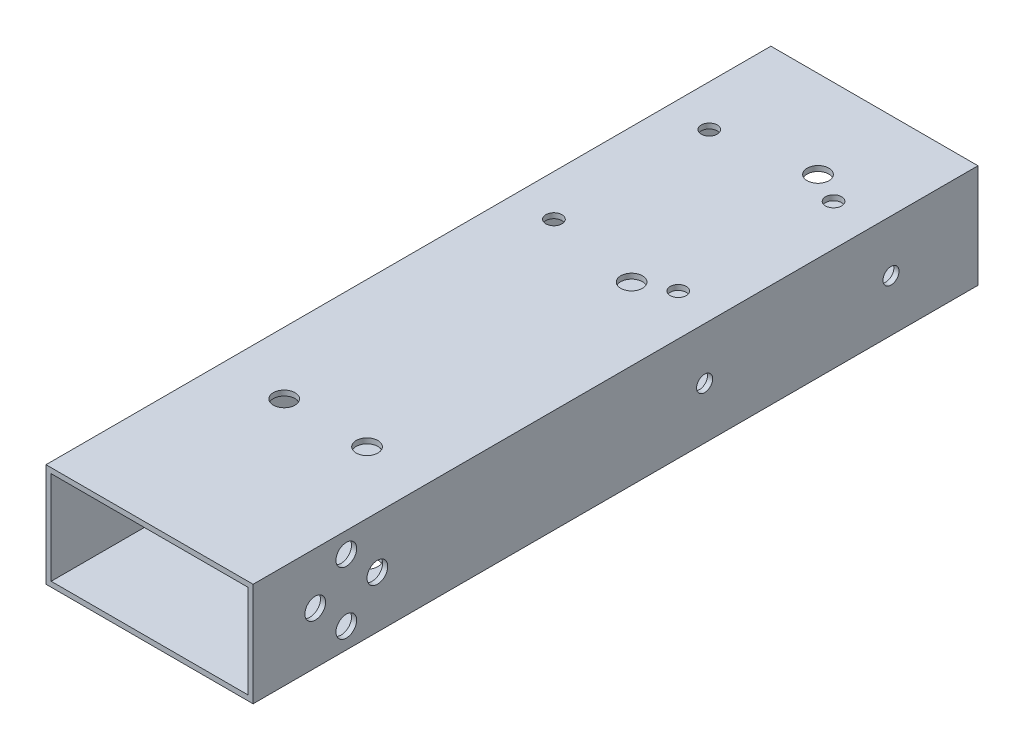
ISO-10303-21;
HEADER;
FILE_DESCRIPTION(('STEP AP214'),'2;1');
FILE_NAME('part.step','',(''),(''),'','','');
FILE_SCHEMA(('AUTOMOTIVE_DESIGN { 1 0 10303 214 1 1 1 1 }'));
ENDSEC;
DATA;
#1=APPLICATION_CONTEXT('core data for automotive mechanical design processes');
#2=APPLICATION_PROTOCOL_DEFINITION('international standard','automotive_design',2000,#1);
#3=PRODUCT_CONTEXT('',#1,'mechanical');
#4=PRODUCT('Part','Part','',(#3));
#5=PRODUCT_RELATED_PRODUCT_CATEGORY('part','',(#4));
#6=PRODUCT_DEFINITION_FORMATION('','',#4);
#7=PRODUCT_DEFINITION_CONTEXT('part definition',#1,'design');
#8=PRODUCT_DEFINITION('design','',#6,#7);
#9=PRODUCT_DEFINITION_SHAPE('','',#8);
#10=(LENGTH_UNIT() NAMED_UNIT(*) SI_UNIT(.MILLI.,.METRE.));
#11=(NAMED_UNIT(*) PLANE_ANGLE_UNIT() SI_UNIT($,.RADIAN.));
#12=(NAMED_UNIT(*) SI_UNIT($,.STERADIAN.) SOLID_ANGLE_UNIT());
#13=UNCERTAINTY_MEASURE_WITH_UNIT(LENGTH_MEASURE(1.E-05),#10,'distance_accuracy_value','');
#14=(GEOMETRIC_REPRESENTATION_CONTEXT(3) GLOBAL_UNCERTAINTY_ASSIGNED_CONTEXT((#13)) GLOBAL_UNIT_ASSIGNED_CONTEXT((#10,
#11,#12)) REPRESENTATION_CONTEXT('',''));
#15=CARTESIAN_POINT('',(0.,0.,0.));
#16=DIRECTION('',(0.,0.,1.));
#17=DIRECTION('',(1.,0.,0.));
#18=AXIS2_PLACEMENT_3D('',#15,#16,#17);
#19=CARTESIAN_POINT('',(0.,0.,140.));
#20=DIRECTION('',(0.,0.,-1.));
#21=DIRECTION('',(-1.,0.,0.));
#22=AXIS2_PLACEMENT_3D('',#19,#20,#21);
#23=PLANE('',#22);
#24=DIRECTION('',(0.,-1.,0.));
#25=VECTOR('',#24,1.);
#26=CARTESIAN_POINT('',(0.,0.,140.));
#27=LINE('',#26,#25);
#28=CARTESIAN_POINT('',(0.,20.,140.));
#29=VERTEX_POINT('',#28);
#30=CARTESIAN_POINT('',(0.,0.,140.));
#31=VERTEX_POINT('',#30);
#32=EDGE_CURVE('E138',#29,#31,#27,.T.);
#33=ORIENTED_EDGE('',*,*,#32,.T.);
#34=DIRECTION('',(1.,0.,0.));
#35=VECTOR('',#34,1.);
#36=CARTESIAN_POINT('',(0.,0.,140.));
#37=LINE('',#36,#35);
#38=CARTESIAN_POINT('',(40.,0.,140.));
#39=VERTEX_POINT('',#38);
#40=EDGE_CURVE('E141',#31,#39,#37,.T.);
#41=ORIENTED_EDGE('',*,*,#40,.T.);
#42=DIRECTION('',(0.,1.,0.));
#43=VECTOR('',#42,1.);
#44=CARTESIAN_POINT('',(40.,0.,140.));
#45=LINE('',#44,#43);
#46=CARTESIAN_POINT('',(40.,20.,140.));
#47=VERTEX_POINT('',#46);
#48=EDGE_CURVE('E144',#39,#47,#45,.T.);
#49=ORIENTED_EDGE('',*,*,#48,.T.);
#50=DIRECTION('',(-1.,0.,0.));
#51=VECTOR('',#50,1.);
#52=CARTESIAN_POINT('',(0.,20.,140.));
#53=LINE('',#52,#51);
#54=EDGE_CURVE('E146',#47,#29,#53,.T.);
#55=ORIENTED_EDGE('',*,*,#54,.T.);
#56=EDGE_LOOP('',(#33,#41,#49,#55));
#57=FACE_BOUND('',#56,.T.);
#58=DIRECTION('',(0.,-1.,0.));
#59=VECTOR('',#58,1.);
#60=CARTESIAN_POINT('',(1.,1.,140.));
#61=LINE('',#60,#59);
#62=CARTESIAN_POINT('',(1.,19.,140.));
#63=VERTEX_POINT('',#62);
#64=CARTESIAN_POINT('',(1.,1.,140.));
#65=VERTEX_POINT('',#64);
#66=EDGE_CURVE('E100',#63,#65,#61,.T.);
#67=ORIENTED_EDGE('',*,*,#66,.F.);
#68=DIRECTION('',(-1.,0.,0.));
#69=VECTOR('',#68,1.);
#70=CARTESIAN_POINT('',(1.,19.,140.));
#71=LINE('',#70,#69);
#72=CARTESIAN_POINT('',(39.,19.,140.));
#73=VERTEX_POINT('',#72);
#74=EDGE_CURVE('E122',#73,#63,#71,.T.);
#75=ORIENTED_EDGE('',*,*,#74,.F.);
#76=DIRECTION('',(0.,1.,0.));
#77=VECTOR('',#76,1.);
#78=CARTESIAN_POINT('',(39.,1.,140.));
#79=LINE('',#78,#77);
#80=CARTESIAN_POINT('',(39.,1.,140.));
#81=VERTEX_POINT('',#80);
#82=EDGE_CURVE('E120',#81,#73,#79,.T.);
#83=ORIENTED_EDGE('',*,*,#82,.F.);
#84=DIRECTION('',(1.,0.,0.));
#85=VECTOR('',#84,1.);
#86=CARTESIAN_POINT('',(1.,1.,140.));
#87=LINE('',#86,#85);
#88=EDGE_CURVE('E108',#65,#81,#87,.T.);
#89=ORIENTED_EDGE('',*,*,#88,.F.);
#90=EDGE_LOOP('',(#67,#75,#83,#89));
#91=FACE_BOUND('',#90,.T.);
#92=ADVANCED_FACE('F33',(#57,#91),#23,.F.);
#93=CARTESIAN_POINT('',(0.,0.,0.));
#94=DIRECTION('',(0.,0.,-1.));
#95=DIRECTION('',(-1.,0.,0.));
#96=AXIS2_PLACEMENT_3D('',#93,#94,#95);
#97=PLANE('',#96);
#98=DIRECTION('',(0.,-1.,0.));
#99=VECTOR('',#98,1.);
#100=CARTESIAN_POINT('',(0.,0.,0.));
#101=LINE('',#100,#99);
#102=CARTESIAN_POINT('',(0.,20.,0.));
#103=VERTEX_POINT('',#102);
#104=CARTESIAN_POINT('',(0.,0.,0.));
#105=VERTEX_POINT('',#104);
#106=EDGE_CURVE('E116',#103,#105,#101,.T.);
#107=ORIENTED_EDGE('',*,*,#106,.F.);
#108=DIRECTION('',(-1.,0.,0.));
#109=VECTOR('',#108,1.);
#110=CARTESIAN_POINT('',(0.,20.,0.));
#111=LINE('',#110,#109);
#112=CARTESIAN_POINT('',(40.,20.,0.));
#113=VERTEX_POINT('',#112);
#114=EDGE_CURVE('E142',#113,#103,#111,.T.);
#115=ORIENTED_EDGE('',*,*,#114,.F.);
#116=DIRECTION('',(0.,1.,0.));
#117=VECTOR('',#116,1.);
#118=CARTESIAN_POINT('',(40.,0.,0.));
#119=LINE('',#118,#117);
#120=CARTESIAN_POINT('',(40.,0.,0.));
#121=VERTEX_POINT('',#120);
#122=EDGE_CURVE('E153',#121,#113,#119,.T.);
#123=ORIENTED_EDGE('',*,*,#122,.F.);
#124=DIRECTION('',(1.,0.,0.));
#125=VECTOR('',#124,1.);
#126=CARTESIAN_POINT('',(0.,0.,0.));
#127=LINE('',#126,#125);
#128=EDGE_CURVE('E151',#105,#121,#127,.T.);
#129=ORIENTED_EDGE('',*,*,#128,.F.);
#130=EDGE_LOOP('',(#107,#115,#123,#129));
#131=FACE_BOUND('',#130,.T.);
#132=DIRECTION('',(-1.,0.,0.));
#133=VECTOR('',#132,1.);
#134=CARTESIAN_POINT('',(1.,19.,0.));
#135=LINE('',#134,#133);
#136=CARTESIAN_POINT('',(39.,19.,0.));
#137=VERTEX_POINT('',#136);
#138=CARTESIAN_POINT('',(1.,19.,0.));
#139=VERTEX_POINT('',#138);
#140=EDGE_CURVE('E109',#137,#139,#135,.T.);
#141=ORIENTED_EDGE('',*,*,#140,.T.);
#142=DIRECTION('',(0.,-1.,0.));
#143=VECTOR('',#142,1.);
#144=CARTESIAN_POINT('',(1.,1.,0.));
#145=LINE('',#144,#143);
#146=CARTESIAN_POINT('',(1.,1.,0.));
#147=VERTEX_POINT('',#146);
#148=EDGE_CURVE('E58',#139,#147,#145,.T.);
#149=ORIENTED_EDGE('',*,*,#148,.T.);
#150=DIRECTION('',(1.,0.,0.));
#151=VECTOR('',#150,1.);
#152=CARTESIAN_POINT('',(1.,1.,0.));
#153=LINE('',#152,#151);
#154=CARTESIAN_POINT('',(39.,1.,0.));
#155=VERTEX_POINT('',#154);
#156=EDGE_CURVE('E115',#147,#155,#153,.T.);
#157=ORIENTED_EDGE('',*,*,#156,.T.);
#158=DIRECTION('',(0.,1.,0.));
#159=VECTOR('',#158,1.);
#160=CARTESIAN_POINT('',(39.,1.,0.));
#161=LINE('',#160,#159);
#162=EDGE_CURVE('E130',#155,#137,#161,.T.);
#163=ORIENTED_EDGE('',*,*,#162,.T.);
#164=EDGE_LOOP('',(#141,#149,#157,#163));
#165=FACE_BOUND('',#164,.T.);
#166=ADVANCED_FACE('F344',(#131,#165),#97,.T.);
#167=CARTESIAN_POINT('',(0.,0.,140.));
#168=DIRECTION('',(1.,0.,0.));
#169=DIRECTION('',(0.,0.,-1.));
#170=AXIS2_PLACEMENT_3D('',#167,#168,#169);
#171=PLANE('',#170);
#172=CARTESIAN_POINT('',(0.,4.,122.));
#173=DIRECTION('',(1.,0.,0.));
#174=DIRECTION('',(0.,0.,-1.));
#175=AXIS2_PLACEMENT_3D('',#172,#173,#174);
#176=CIRCLE('',#175,2.);
#177=CARTESIAN_POINT('',(0.,4.,120.));
#178=VERTEX_POINT('',#177);
#179=EDGE_CURVE('E283',#178,#178,#176,.T.);
#180=ORIENTED_EDGE('',*,*,#179,.T.);
#181=EDGE_LOOP('',(#180));
#182=FACE_BOUND('',#181,.T.);
#183=CARTESIAN_POINT('',(0.,10.,128.));
#184=DIRECTION('',(1.,0.,0.));
#185=DIRECTION('',(0.,0.,-1.));
#186=AXIS2_PLACEMENT_3D('',#183,#184,#185);
#187=CIRCLE('',#186,2.);
#188=CARTESIAN_POINT('',(0.,10.,126.));
#189=VERTEX_POINT('',#188);
#190=EDGE_CURVE('E302',#189,#189,#187,.T.);
#191=ORIENTED_EDGE('',*,*,#190,.T.);
#192=EDGE_LOOP('',(#191));
#193=FACE_BOUND('',#192,.T.);
#194=CARTESIAN_POINT('',(0.,10.,16.8));
#195=DIRECTION('',(1.,0.,0.));
#196=DIRECTION('',(0.,0.,-1.));
#197=AXIS2_PLACEMENT_3D('',#194,#195,#196);
#198=CIRCLE('',#197,1.55);
#199=CARTESIAN_POINT('',(0.,10.,15.25));
#200=VERTEX_POINT('',#199);
#201=EDGE_CURVE('E287',#200,#200,#198,.T.);
#202=ORIENTED_EDGE('',*,*,#201,.T.);
#203=EDGE_LOOP('',(#202));
#204=FACE_BOUND('',#203,.T.);
#205=CARTESIAN_POINT('',(0.,9.99999999999999,52.8));
#206=DIRECTION('',(1.,0.,0.));
#207=DIRECTION('',(0.,0.,-1.));
#208=AXIS2_PLACEMENT_3D('',#205,#206,#207);
#209=CIRCLE('',#208,1.55);
#210=CARTESIAN_POINT('',(0.,9.99999999999999,51.25));
#211=VERTEX_POINT('',#210);
#212=EDGE_CURVE('E288',#211,#211,#209,.T.);
#213=ORIENTED_EDGE('',*,*,#212,.T.);
#214=EDGE_LOOP('',(#213));
#215=FACE_BOUND('',#214,.T.);
#216=CARTESIAN_POINT('',(0.,16.,122.));
#217=DIRECTION('',(1.,0.,0.));
#218=DIRECTION('',(0.,0.,-1.));
#219=AXIS2_PLACEMENT_3D('',#216,#217,#218);
#220=CIRCLE('',#219,2.);
#221=CARTESIAN_POINT('',(0.,16.,120.));
#222=VERTEX_POINT('',#221);
#223=EDGE_CURVE('E294',#222,#222,#220,.T.);
#224=ORIENTED_EDGE('',*,*,#223,.T.);
#225=EDGE_LOOP('',(#224));
#226=FACE_BOUND('',#225,.T.);
#227=CARTESIAN_POINT('',(0.,10.,116.));
#228=DIRECTION('',(1.,0.,0.));
#229=DIRECTION('',(0.,0.,-1.));
#230=AXIS2_PLACEMENT_3D('',#227,#228,#229);
#231=CIRCLE('',#230,2.);
#232=CARTESIAN_POINT('',(0.,10.,114.));
#233=VERTEX_POINT('',#232);
#234=EDGE_CURVE('E301',#233,#233,#231,.T.);
#235=ORIENTED_EDGE('',*,*,#234,.T.);
#236=EDGE_LOOP('',(#235));
#237=FACE_BOUND('',#236,.T.);
#238=ORIENTED_EDGE('',*,*,#106,.T.);
#239=DIRECTION('',(0.,0.,-1.));
#240=VECTOR('',#239,1.);
#241=CARTESIAN_POINT('',(0.,0.,140.));
#242=LINE('',#241,#240);
#243=EDGE_CURVE('E11',#31,#105,#242,.T.);
#244=ORIENTED_EDGE('',*,*,#243,.F.);
#245=ORIENTED_EDGE('',*,*,#32,.F.);
#246=DIRECTION('',(0.,0.,-1.));
#247=VECTOR('',#246,1.);
#248=CARTESIAN_POINT('',(0.,20.,140.));
#249=LINE('',#248,#247);
#250=EDGE_CURVE('E148',#29,#103,#249,.T.);
#251=ORIENTED_EDGE('',*,*,#250,.T.);
#252=EDGE_LOOP('',(#238,#244,#245,#251));
#253=FACE_BOUND('',#252,.T.);
#254=ADVANCED_FACE('F35',(#182,#193,#204,#215,#226,#237,#253),#171,.F.);
#255=CARTESIAN_POINT('',(0.,0.,140.));
#256=DIRECTION('',(0.,1.,0.));
#257=DIRECTION('',(0.,0.,1.));
#258=AXIS2_PLACEMENT_3D('',#255,#256,#257);
#259=PLANE('',#258);
#260=CARTESIAN_POINT('',(28.,0.,106.));
#261=DIRECTION('',(0.,1.,0.));
#262=DIRECTION('',(0.,0.,1.));
#263=AXIS2_PLACEMENT_3D('',#260,#261,#262);
#264=CIRCLE('',#263,2.1);
#265=CARTESIAN_POINT('',(28.,0.,108.1));
#266=VERTEX_POINT('',#265);
#267=EDGE_CURVE('E214',#266,#266,#264,.T.);
#268=ORIENTED_EDGE('',*,*,#267,.T.);
#269=EDGE_LOOP('',(#268));
#270=FACE_BOUND('',#269,.T.);
#271=CARTESIAN_POINT('',(12.,0.,106.));
#272=DIRECTION('',(0.,1.,0.));
#273=DIRECTION('',(0.,0.,1.));
#274=AXIS2_PLACEMENT_3D('',#271,#272,#273);
#275=CIRCLE('',#274,2.1);
#276=CARTESIAN_POINT('',(12.,0.,108.1));
#277=VERTEX_POINT('',#276);
#278=EDGE_CURVE('E225',#277,#277,#275,.T.);
#279=ORIENTED_EDGE('',*,*,#278,.T.);
#280=EDGE_LOOP('',(#279));
#281=FACE_BOUND('',#280,.T.);
#282=CARTESIAN_POINT('',(32.,0.,19.9));
#283=DIRECTION('',(0.,1.,0.));
#284=DIRECTION('',(0.,0.,-1.));
#285=AXIS2_PLACEMENT_3D('',#282,#283,#284);
#286=CIRCLE('',#285,1.54999999999999);
#287=CARTESIAN_POINT('',(32.,0.,18.35));
#288=VERTEX_POINT('',#287);
#289=EDGE_CURVE('E247',#288,#288,#286,.T.);
#290=ORIENTED_EDGE('',*,*,#289,.T.);
#291=EDGE_LOOP('',(#290));
#292=FACE_BOUND('',#291,.T.);
#293=CARTESIAN_POINT('',(32.,0.,49.9));
#294=DIRECTION('',(0.,1.,0.));
#295=DIRECTION('',(0.,0.,1.));
#296=AXIS2_PLACEMENT_3D('',#293,#294,#295);
#297=CIRCLE('',#296,1.55);
#298=CARTESIAN_POINT('',(32.,0.,51.45));
#299=VERTEX_POINT('',#298);
#300=EDGE_CURVE('E253',#299,#299,#297,.T.);
#301=ORIENTED_EDGE('',*,*,#300,.T.);
#302=EDGE_LOOP('',(#301));
#303=FACE_BOUND('',#302,.T.);
#304=CARTESIAN_POINT('',(8.,0.,49.9));
#305=DIRECTION('',(0.,1.,0.));
#306=DIRECTION('',(0.,0.,-1.));
#307=AXIS2_PLACEMENT_3D('',#304,#305,#306);
#308=CIRCLE('',#307,1.55);
#309=CARTESIAN_POINT('',(8.,0.,48.35));
#310=VERTEX_POINT('',#309);
#311=EDGE_CURVE('E259',#310,#310,#308,.T.);
#312=ORIENTED_EDGE('',*,*,#311,.T.);
#313=EDGE_LOOP('',(#312));
#314=FACE_BOUND('',#313,.T.);
#315=CARTESIAN_POINT('',(26.,0.,16.9));
#316=DIRECTION('',(0.,1.,0.));
#317=DIRECTION('',(0.,0.,1.));
#318=AXIS2_PLACEMENT_3D('',#315,#316,#317);
#319=CIRCLE('',#318,2.1);
#320=CARTESIAN_POINT('',(26.,0.,19.));
#321=VERTEX_POINT('',#320);
#322=EDGE_CURVE('E240',#321,#321,#319,.T.);
#323=ORIENTED_EDGE('',*,*,#322,.T.);
#324=EDGE_LOOP('',(#323));
#325=FACE_BOUND('',#324,.T.);
#326=CARTESIAN_POINT('',(26.,0.,52.9));
#327=DIRECTION('',(0.,1.,0.));
#328=DIRECTION('',(0.,0.,1.));
#329=AXIS2_PLACEMENT_3D('',#326,#327,#328);
#330=CIRCLE('',#329,2.1);
#331=CARTESIAN_POINT('',(26.,0.,55.));
#332=VERTEX_POINT('',#331);
#333=EDGE_CURVE('E236',#332,#332,#330,.T.);
#334=ORIENTED_EDGE('',*,*,#333,.T.);
#335=EDGE_LOOP('',(#334));
#336=FACE_BOUND('',#335,.T.);
#337=CARTESIAN_POINT('',(8.,0.,19.9));
#338=DIRECTION('',(0.,1.,0.));
#339=DIRECTION('',(0.,0.,1.));
#340=AXIS2_PLACEMENT_3D('',#337,#338,#339);
#341=CIRCLE('',#340,1.55);
#342=CARTESIAN_POINT('',(8.,0.,21.45));
#343=VERTEX_POINT('',#342);
#344=EDGE_CURVE('E246',#343,#343,#341,.T.);
#345=ORIENTED_EDGE('',*,*,#344,.T.);
#346=EDGE_LOOP('',(#345));
#347=FACE_BOUND('',#346,.T.);
#348=ORIENTED_EDGE('',*,*,#128,.T.);
#349=DIRECTION('',(0.,0.,-1.));
#350=VECTOR('',#349,1.);
#351=CARTESIAN_POINT('',(40.,0.,140.));
#352=LINE('',#351,#350);
#353=EDGE_CURVE('E42',#39,#121,#352,.T.);
#354=ORIENTED_EDGE('',*,*,#353,.F.);
#355=ORIENTED_EDGE('',*,*,#40,.F.);
#356=ORIENTED_EDGE('',*,*,#243,.T.);
#357=EDGE_LOOP('',(#348,#354,#355,#356));
#358=FACE_BOUND('',#357,.T.);
#359=ADVANCED_FACE('F343',(#270,#281,#292,#303,#314,#325,#336,#347,#358),#259,.F.);
#360=CARTESIAN_POINT('',(40.,0.,140.));
#361=DIRECTION('',(-1.,0.,0.));
#362=DIRECTION('',(0.,0.,1.));
#363=AXIS2_PLACEMENT_3D('',#360,#361,#362);
#364=PLANE('',#363);
#365=CARTESIAN_POINT('',(40.,4.,122.));
#366=DIRECTION('',(1.,0.,0.));
#367=DIRECTION('',(0.,0.,-1.));
#368=AXIS2_PLACEMENT_3D('',#365,#366,#367);
#369=CIRCLE('',#368,2.);
#370=CARTESIAN_POINT('',(40.,4.,120.));
#371=VERTEX_POINT('',#370);
#372=EDGE_CURVE('E297',#371,#371,#369,.T.);
#373=ORIENTED_EDGE('',*,*,#372,.F.);
#374=EDGE_LOOP('',(#373));
#375=FACE_BOUND('',#374,.T.);
#376=CARTESIAN_POINT('',(40.,10.,128.));
#377=DIRECTION('',(1.,0.,0.));
#378=DIRECTION('',(0.,0.,-1.));
#379=AXIS2_PLACEMENT_3D('',#376,#377,#378);
#380=CIRCLE('',#379,2.);
#381=CARTESIAN_POINT('',(40.,10.,126.));
#382=VERTEX_POINT('',#381);
#383=EDGE_CURVE('E298',#382,#382,#380,.T.);
#384=ORIENTED_EDGE('',*,*,#383,.F.);
#385=EDGE_LOOP('',(#384));
#386=FACE_BOUND('',#385,.T.);
#387=CARTESIAN_POINT('',(40.,10.,16.8));
#388=DIRECTION('',(1.,0.,0.));
#389=DIRECTION('',(0.,0.,-1.));
#390=AXIS2_PLACEMENT_3D('',#387,#388,#389);
#391=CIRCLE('',#390,1.55);
#392=CARTESIAN_POINT('',(40.,10.,15.25));
#393=VERTEX_POINT('',#392);
#394=EDGE_CURVE('E305',#393,#393,#391,.T.);
#395=ORIENTED_EDGE('',*,*,#394,.F.);
#396=EDGE_LOOP('',(#395));
#397=FACE_BOUND('',#396,.T.);
#398=CARTESIAN_POINT('',(40.,9.99999999999999,52.8));
#399=DIRECTION('',(1.,0.,0.));
#400=DIRECTION('',(0.,0.,-1.));
#401=AXIS2_PLACEMENT_3D('',#398,#399,#400);
#402=CIRCLE('',#401,1.55);
#403=CARTESIAN_POINT('',(40.,9.99999999999999,51.25));
#404=VERTEX_POINT('',#403);
#405=EDGE_CURVE('E284',#404,#404,#402,.T.);
#406=ORIENTED_EDGE('',*,*,#405,.F.);
#407=EDGE_LOOP('',(#406));
#408=FACE_BOUND('',#407,.T.);
#409=CARTESIAN_POINT('',(40.,16.,122.));
#410=DIRECTION('',(1.,0.,0.));
#411=DIRECTION('',(0.,0.,-1.));
#412=AXIS2_PLACEMENT_3D('',#409,#410,#411);
#413=CIRCLE('',#412,2.);
#414=CARTESIAN_POINT('',(40.,16.,120.));
#415=VERTEX_POINT('',#414);
#416=EDGE_CURVE('E291',#415,#415,#413,.T.);
#417=ORIENTED_EDGE('',*,*,#416,.F.);
#418=EDGE_LOOP('',(#417));
#419=FACE_BOUND('',#418,.T.);
#420=CARTESIAN_POINT('',(40.,10.,116.));
#421=DIRECTION('',(1.,0.,0.));
#422=DIRECTION('',(0.,0.,-1.));
#423=AXIS2_PLACEMENT_3D('',#420,#421,#422);
#424=CIRCLE('',#423,2.);
#425=CARTESIAN_POINT('',(40.,10.,114.));
#426=VERTEX_POINT('',#425);
#427=EDGE_CURVE('E167',#426,#426,#424,.T.);
#428=ORIENTED_EDGE('',*,*,#427,.F.);
#429=EDGE_LOOP('',(#428));
#430=FACE_BOUND('',#429,.T.);
#431=ORIENTED_EDGE('',*,*,#122,.T.);
#432=DIRECTION('',(0.,0.,-1.));
#433=VECTOR('',#432,1.);
#434=CARTESIAN_POINT('',(40.,20.,140.));
#435=LINE('',#434,#433);
#436=EDGE_CURVE('E158',#47,#113,#435,.T.);
#437=ORIENTED_EDGE('',*,*,#436,.F.);
#438=ORIENTED_EDGE('',*,*,#48,.F.);
#439=ORIENTED_EDGE('',*,*,#353,.T.);
#440=EDGE_LOOP('',(#431,#437,#438,#439));
#441=FACE_BOUND('',#440,.T.);
#442=ADVANCED_FACE('F372',(#375,#386,#397,#408,#419,#430,#441),#364,.F.);
#443=CARTESIAN_POINT('',(0.,20.,140.));
#444=DIRECTION('',(0.,-1.,0.));
#445=DIRECTION('',(0.,0.,-1.));
#446=AXIS2_PLACEMENT_3D('',#443,#444,#445);
#447=PLANE('',#446);
#448=CARTESIAN_POINT('',(28.,20.,106.));
#449=DIRECTION('',(0.,1.,0.));
#450=DIRECTION('',(0.,0.,1.));
#451=AXIS2_PLACEMENT_3D('',#448,#449,#450);
#452=CIRCLE('',#451,2.1);
#453=CARTESIAN_POINT('',(28.,20.,108.1));
#454=VERTEX_POINT('',#453);
#455=EDGE_CURVE('E220',#454,#454,#452,.T.);
#456=ORIENTED_EDGE('',*,*,#455,.F.);
#457=EDGE_LOOP('',(#456));
#458=FACE_BOUND('',#457,.T.);
#459=CARTESIAN_POINT('',(12.,20.,106.));
#460=DIRECTION('',(0.,1.,0.));
#461=DIRECTION('',(0.,0.,1.));
#462=AXIS2_PLACEMENT_3D('',#459,#460,#461);
#463=CIRCLE('',#462,2.1);
#464=CARTESIAN_POINT('',(12.,20.,108.1));
#465=VERTEX_POINT('',#464);
#466=EDGE_CURVE('E230',#465,#465,#463,.T.);
#467=ORIENTED_EDGE('',*,*,#466,.F.);
#468=EDGE_LOOP('',(#467));
#469=FACE_BOUND('',#468,.T.);
#470=CARTESIAN_POINT('',(32.,20.,19.9));
#471=DIRECTION('',(0.,1.,0.));
#472=DIRECTION('',(0.,0.,-1.));
#473=AXIS2_PLACEMENT_3D('',#470,#471,#472);
#474=CIRCLE('',#473,1.54999999999999);
#475=CARTESIAN_POINT('',(32.,20.,18.35));
#476=VERTEX_POINT('',#475);
#477=EDGE_CURVE('E243',#476,#476,#474,.T.);
#478=ORIENTED_EDGE('',*,*,#477,.F.);
#479=EDGE_LOOP('',(#478));
#480=FACE_BOUND('',#479,.T.);
#481=CARTESIAN_POINT('',(32.,20.,49.9));
#482=DIRECTION('',(0.,1.,0.));
#483=DIRECTION('',(0.,0.,1.));
#484=AXIS2_PLACEMENT_3D('',#481,#482,#483);
#485=CIRCLE('',#484,1.55);
#486=CARTESIAN_POINT('',(32.,20.,51.45));
#487=VERTEX_POINT('',#486);
#488=EDGE_CURVE('E250',#487,#487,#485,.T.);
#489=ORIENTED_EDGE('',*,*,#488,.F.);
#490=EDGE_LOOP('',(#489));
#491=FACE_BOUND('',#490,.T.);
#492=CARTESIAN_POINT('',(8.,20.,49.9));
#493=DIRECTION('',(0.,1.,0.));
#494=DIRECTION('',(0.,0.,-1.));
#495=AXIS2_PLACEMENT_3D('',#492,#493,#494);
#496=CIRCLE('',#495,1.55);
#497=CARTESIAN_POINT('',(8.,20.,48.35));
#498=VERTEX_POINT('',#497);
#499=EDGE_CURVE('E256',#498,#498,#496,.T.);
#500=ORIENTED_EDGE('',*,*,#499,.F.);
#501=EDGE_LOOP('',(#500));
#502=FACE_BOUND('',#501,.T.);
#503=CARTESIAN_POINT('',(26.,20.,16.9));
#504=DIRECTION('',(0.,1.,0.));
#505=DIRECTION('',(0.,0.,1.));
#506=AXIS2_PLACEMENT_3D('',#503,#504,#505);
#507=CIRCLE('',#506,2.1);
#508=CARTESIAN_POINT('',(26.,20.,19.));
#509=VERTEX_POINT('',#508);
#510=EDGE_CURVE('E262',#509,#509,#507,.T.);
#511=ORIENTED_EDGE('',*,*,#510,.F.);
#512=EDGE_LOOP('',(#511));
#513=FACE_BOUND('',#512,.T.);
#514=CARTESIAN_POINT('',(26.,20.,52.9));
#515=DIRECTION('',(0.,1.,0.));
#516=DIRECTION('',(0.,0.,1.));
#517=AXIS2_PLACEMENT_3D('',#514,#515,#516);
#518=CIRCLE('',#517,2.1);
#519=CARTESIAN_POINT('',(26.,20.,55.));
#520=VERTEX_POINT('',#519);
#521=EDGE_CURVE('E237',#520,#520,#518,.T.);
#522=ORIENTED_EDGE('',*,*,#521,.F.);
#523=EDGE_LOOP('',(#522));
#524=FACE_BOUND('',#523,.T.);
#525=CARTESIAN_POINT('',(8.,20.,19.9));
#526=DIRECTION('',(0.,1.,0.));
#527=DIRECTION('',(0.,0.,1.));
#528=AXIS2_PLACEMENT_3D('',#525,#526,#527);
#529=CIRCLE('',#528,1.55);
#530=CARTESIAN_POINT('',(8.,20.,21.45));
#531=VERTEX_POINT('',#530);
#532=EDGE_CURVE('E191',#531,#531,#529,.T.);
#533=ORIENTED_EDGE('',*,*,#532,.F.);
#534=EDGE_LOOP('',(#533));
#535=FACE_BOUND('',#534,.T.);
#536=ORIENTED_EDGE('',*,*,#114,.T.);
#537=ORIENTED_EDGE('',*,*,#250,.F.);
#538=ORIENTED_EDGE('',*,*,#54,.F.);
#539=ORIENTED_EDGE('',*,*,#436,.T.);
#540=EDGE_LOOP('',(#536,#537,#538,#539));
#541=FACE_BOUND('',#540,.T.);
#542=ADVANCED_FACE('F370',(#458,#469,#480,#491,#502,#513,#524,#535,#541),#447,.F.);
#543=CARTESIAN_POINT('',(1.,1.,140.));
#544=DIRECTION('',(1.,0.,0.));
#545=DIRECTION('',(0.,0.,-1.));
#546=AXIS2_PLACEMENT_3D('',#543,#544,#545);
#547=PLANE('',#546);
#548=CARTESIAN_POINT('',(1.,4.,122.));
#549=DIRECTION('',(1.,0.,0.));
#550=DIRECTION('',(0.,0.,-1.));
#551=AXIS2_PLACEMENT_3D('',#548,#549,#550);
#552=CIRCLE('',#551,2.);
#553=CARTESIAN_POINT('',(1.,4.,120.));
#554=VERTEX_POINT('',#553);
#555=EDGE_CURVE('E128',#554,#554,#552,.F.);
#556=ORIENTED_EDGE('',*,*,#555,.T.);
#557=EDGE_LOOP('',(#556));
#558=FACE_BOUND('',#557,.T.);
#559=CARTESIAN_POINT('',(1.,10.,128.));
#560=DIRECTION('',(1.,0.,0.));
#561=DIRECTION('',(0.,0.,-1.));
#562=AXIS2_PLACEMENT_3D('',#559,#560,#561);
#563=CIRCLE('',#562,2.);
#564=CARTESIAN_POINT('',(1.,10.,126.));
#565=VERTEX_POINT('',#564);
#566=EDGE_CURVE('E183',#565,#565,#563,.F.);
#567=ORIENTED_EDGE('',*,*,#566,.T.);
#568=EDGE_LOOP('',(#567));
#569=FACE_BOUND('',#568,.T.);
#570=CARTESIAN_POINT('',(1.,10.,16.8));
#571=DIRECTION('',(1.,0.,0.));
#572=DIRECTION('',(0.,0.,-1.));
#573=AXIS2_PLACEMENT_3D('',#570,#571,#572);
#574=CIRCLE('',#573,1.55);
#575=CARTESIAN_POINT('',(1.,10.,15.25));
#576=VERTEX_POINT('',#575);
#577=EDGE_CURVE('E179',#576,#576,#574,.F.);
#578=ORIENTED_EDGE('',*,*,#577,.T.);
#579=EDGE_LOOP('',(#578));
#580=FACE_BOUND('',#579,.T.);
#581=CARTESIAN_POINT('',(1.,9.99999999999999,52.8));
#582=DIRECTION('',(1.,0.,0.));
#583=DIRECTION('',(0.,0.,-1.));
#584=AXIS2_PLACEMENT_3D('',#581,#582,#583);
#585=CIRCLE('',#584,1.55);
#586=CARTESIAN_POINT('',(1.,9.99999999999999,51.25));
#587=VERTEX_POINT('',#586);
#588=EDGE_CURVE('E175',#587,#587,#585,.F.);
#589=ORIENTED_EDGE('',*,*,#588,.T.);
#590=EDGE_LOOP('',(#589));
#591=FACE_BOUND('',#590,.T.);
#592=CARTESIAN_POINT('',(1.,16.,122.));
#593=DIRECTION('',(1.,0.,0.));
#594=DIRECTION('',(0.,0.,-1.));
#595=AXIS2_PLACEMENT_3D('',#592,#593,#594);
#596=CIRCLE('',#595,2.);
#597=CARTESIAN_POINT('',(1.,16.,120.));
#598=VERTEX_POINT('',#597);
#599=EDGE_CURVE('E171',#598,#598,#596,.F.);
#600=ORIENTED_EDGE('',*,*,#599,.T.);
#601=EDGE_LOOP('',(#600));
#602=FACE_BOUND('',#601,.T.);
#603=CARTESIAN_POINT('',(1.,10.,116.));
#604=DIRECTION('',(1.,0.,0.));
#605=DIRECTION('',(0.,0.,-1.));
#606=AXIS2_PLACEMENT_3D('',#603,#604,#605);
#607=CIRCLE('',#606,2.);
#608=CARTESIAN_POINT('',(1.,10.,114.));
#609=VERTEX_POINT('',#608);
#610=EDGE_CURVE('E166',#609,#609,#607,.F.);
#611=ORIENTED_EDGE('',*,*,#610,.T.);
#612=EDGE_LOOP('',(#611));
#613=FACE_BOUND('',#612,.T.);
#614=ORIENTED_EDGE('',*,*,#148,.F.);
#615=DIRECTION('',(0.,0.,-1.));
#616=VECTOR('',#615,1.);
#617=CARTESIAN_POINT('',(1.,19.,140.));
#618=LINE('',#617,#616);
#619=EDGE_CURVE('E104',#63,#139,#618,.T.);
#620=ORIENTED_EDGE('',*,*,#619,.F.);
#621=ORIENTED_EDGE('',*,*,#66,.T.);
#622=DIRECTION('',(0.,0.,-1.));
#623=VECTOR('',#622,1.);
#624=CARTESIAN_POINT('',(1.,1.,140.));
#625=LINE('',#624,#623);
#626=EDGE_CURVE('E103',#65,#147,#625,.T.);
#627=ORIENTED_EDGE('',*,*,#626,.T.);
#628=EDGE_LOOP('',(#614,#620,#621,#627));
#629=FACE_BOUND('',#628,.T.);
#630=ADVANCED_FACE('F102',(#558,#569,#580,#591,#602,#613,#629),#547,.T.);
#631=CARTESIAN_POINT('',(1.,1.,140.));
#632=DIRECTION('',(0.,1.,0.));
#633=DIRECTION('',(0.,0.,1.));
#634=AXIS2_PLACEMENT_3D('',#631,#632,#633);
#635=PLANE('',#634);
#636=CARTESIAN_POINT('',(28.,1.,106.));
#637=DIRECTION('',(0.,1.,0.));
#638=DIRECTION('',(0.,0.,1.));
#639=AXIS2_PLACEMENT_3D('',#636,#637,#638);
#640=CIRCLE('',#639,2.1);
#641=CARTESIAN_POINT('',(28.,1.,108.1));
#642=VERTEX_POINT('',#641);
#643=EDGE_CURVE('E233',#642,#642,#640,.T.);
#644=ORIENTED_EDGE('',*,*,#643,.F.);
#645=EDGE_LOOP('',(#644));
#646=FACE_BOUND('',#645,.T.);
#647=CARTESIAN_POINT('',(12.,1.,106.));
#648=DIRECTION('',(0.,1.,0.));
#649=DIRECTION('',(0.,0.,1.));
#650=AXIS2_PLACEMENT_3D('',#647,#648,#649);
#651=CIRCLE('',#650,2.1);
#652=CARTESIAN_POINT('',(12.,1.,108.1));
#653=VERTEX_POINT('',#652);
#654=EDGE_CURVE('E213',#653,#653,#651,.T.);
#655=ORIENTED_EDGE('',*,*,#654,.F.);
#656=EDGE_LOOP('',(#655));
#657=FACE_BOUND('',#656,.T.);
#658=CARTESIAN_POINT('',(32.,1.,19.9));
#659=DIRECTION('',(0.,1.,0.));
#660=DIRECTION('',(0.,0.,1.));
#661=AXIS2_PLACEMENT_3D('',#658,#659,#660);
#662=CIRCLE('',#661,1.54999999999999);
#663=CARTESIAN_POINT('',(32.,1.,21.45));
#664=VERTEX_POINT('',#663);
#665=EDGE_CURVE('E210',#664,#664,#662,.F.);
#666=ORIENTED_EDGE('',*,*,#665,.T.);
#667=EDGE_LOOP('',(#666));
#668=FACE_BOUND('',#667,.T.);
#669=CARTESIAN_POINT('',(32.,1.,49.9));
#670=DIRECTION('',(0.,1.,0.));
#671=DIRECTION('',(0.,0.,1.));
#672=AXIS2_PLACEMENT_3D('',#669,#670,#671);
#673=CIRCLE('',#672,1.55);
#674=CARTESIAN_POINT('',(32.,1.,51.45));
#675=VERTEX_POINT('',#674);
#676=EDGE_CURVE('E207',#675,#675,#673,.F.);
#677=ORIENTED_EDGE('',*,*,#676,.T.);
#678=EDGE_LOOP('',(#677));
#679=FACE_BOUND('',#678,.T.);
#680=CARTESIAN_POINT('',(8.,1.,49.9));
#681=DIRECTION('',(0.,1.,0.));
#682=DIRECTION('',(0.,0.,1.));
#683=AXIS2_PLACEMENT_3D('',#680,#681,#682);
#684=CIRCLE('',#683,1.55);
#685=CARTESIAN_POINT('',(8.,1.,51.45));
#686=VERTEX_POINT('',#685);
#687=EDGE_CURVE('E203',#686,#686,#684,.F.);
#688=ORIENTED_EDGE('',*,*,#687,.T.);
#689=EDGE_LOOP('',(#688));
#690=FACE_BOUND('',#689,.T.);
#691=CARTESIAN_POINT('',(26.,1.,16.9));
#692=DIRECTION('',(0.,1.,0.));
#693=DIRECTION('',(0.,0.,1.));
#694=AXIS2_PLACEMENT_3D('',#691,#692,#693);
#695=CIRCLE('',#694,2.1);
#696=CARTESIAN_POINT('',(26.,1.,19.));
#697=VERTEX_POINT('',#696);
#698=EDGE_CURVE('E199',#697,#697,#695,.F.);
#699=ORIENTED_EDGE('',*,*,#698,.T.);
#700=EDGE_LOOP('',(#699));
#701=FACE_BOUND('',#700,.T.);
#702=CARTESIAN_POINT('',(26.,1.,52.9));
#703=DIRECTION('',(0.,1.,0.));
#704=DIRECTION('',(0.,0.,1.));
#705=AXIS2_PLACEMENT_3D('',#702,#703,#704);
#706=CIRCLE('',#705,2.1);
#707=CARTESIAN_POINT('',(26.,1.,55.));
#708=VERTEX_POINT('',#707);
#709=EDGE_CURVE('E195',#708,#708,#706,.F.);
#710=ORIENTED_EDGE('',*,*,#709,.T.);
#711=EDGE_LOOP('',(#710));
#712=FACE_BOUND('',#711,.T.);
#713=CARTESIAN_POINT('',(8.,1.,19.9));
#714=DIRECTION('',(0.,1.,0.));
#715=DIRECTION('',(0.,0.,1.));
#716=AXIS2_PLACEMENT_3D('',#713,#714,#715);
#717=CIRCLE('',#716,1.55);
#718=CARTESIAN_POINT('',(8.,1.,21.45));
#719=VERTEX_POINT('',#718);
#720=EDGE_CURVE('E190',#719,#719,#717,.F.);
#721=ORIENTED_EDGE('',*,*,#720,.T.);
#722=EDGE_LOOP('',(#721));
#723=FACE_BOUND('',#722,.T.);
#724=ORIENTED_EDGE('',*,*,#156,.F.);
#725=ORIENTED_EDGE('',*,*,#626,.F.);
#726=ORIENTED_EDGE('',*,*,#88,.T.);
#727=DIRECTION('',(0.,0.,-1.));
#728=VECTOR('',#727,1.);
#729=CARTESIAN_POINT('',(39.,1.,140.));
#730=LINE('',#729,#728);
#731=EDGE_CURVE('E117',#81,#155,#730,.T.);
#732=ORIENTED_EDGE('',*,*,#731,.T.);
#733=EDGE_LOOP('',(#724,#725,#726,#732));
#734=FACE_BOUND('',#733,.T.);
#735=ADVANCED_FACE('F112',(#646,#657,#668,#679,#690,#701,#712,#723,#734),#635,.T.);
#736=CARTESIAN_POINT('',(39.,1.,140.));
#737=DIRECTION('',(-1.,0.,0.));
#738=DIRECTION('',(0.,0.,1.));
#739=AXIS2_PLACEMENT_3D('',#736,#737,#738);
#740=PLANE('',#739);
#741=CARTESIAN_POINT('',(39.,4.,122.));
#742=DIRECTION('',(-1.,0.,0.));
#743=DIRECTION('',(0.,0.,1.));
#744=AXIS2_PLACEMENT_3D('',#741,#742,#743);
#745=CIRCLE('',#744,2.);
#746=CARTESIAN_POINT('',(39.,4.,124.));
#747=VERTEX_POINT('',#746);
#748=EDGE_CURVE('E184',#747,#747,#745,.F.);
#749=ORIENTED_EDGE('',*,*,#748,.T.);
#750=EDGE_LOOP('',(#749));
#751=FACE_BOUND('',#750,.T.);
#752=CARTESIAN_POINT('',(39.,10.,128.));
#753=DIRECTION('',(-1.,0.,0.));
#754=DIRECTION('',(0.,0.,1.));
#755=AXIS2_PLACEMENT_3D('',#752,#753,#754);
#756=CIRCLE('',#755,2.);
#757=CARTESIAN_POINT('',(39.,10.,130.));
#758=VERTEX_POINT('',#757);
#759=EDGE_CURVE('E180',#758,#758,#756,.F.);
#760=ORIENTED_EDGE('',*,*,#759,.T.);
#761=EDGE_LOOP('',(#760));
#762=FACE_BOUND('',#761,.T.);
#763=CARTESIAN_POINT('',(39.,10.,16.8));
#764=DIRECTION('',(-1.,0.,0.));
#765=DIRECTION('',(0.,0.,1.));
#766=AXIS2_PLACEMENT_3D('',#763,#764,#765);
#767=CIRCLE('',#766,1.55);
#768=CARTESIAN_POINT('',(39.,10.,18.35));
#769=VERTEX_POINT('',#768);
#770=EDGE_CURVE('E176',#769,#769,#767,.F.);
#771=ORIENTED_EDGE('',*,*,#770,.T.);
#772=EDGE_LOOP('',(#771));
#773=FACE_BOUND('',#772,.T.);
#774=CARTESIAN_POINT('',(39.,9.99999999999999,52.8));
#775=DIRECTION('',(-1.,0.,0.));
#776=DIRECTION('',(0.,0.,1.));
#777=AXIS2_PLACEMENT_3D('',#774,#775,#776);
#778=CIRCLE('',#777,1.55);
#779=CARTESIAN_POINT('',(39.,9.99999999999999,54.35));
#780=VERTEX_POINT('',#779);
#781=EDGE_CURVE('E172',#780,#780,#778,.F.);
#782=ORIENTED_EDGE('',*,*,#781,.T.);
#783=EDGE_LOOP('',(#782));
#784=FACE_BOUND('',#783,.T.);
#785=CARTESIAN_POINT('',(39.,16.,122.));
#786=DIRECTION('',(-1.,0.,0.));
#787=DIRECTION('',(0.,0.,1.));
#788=AXIS2_PLACEMENT_3D('',#785,#786,#787);
#789=CIRCLE('',#788,2.);
#790=CARTESIAN_POINT('',(39.,16.,124.));
#791=VERTEX_POINT('',#790);
#792=EDGE_CURVE('E168',#791,#791,#789,.F.);
#793=ORIENTED_EDGE('',*,*,#792,.T.);
#794=EDGE_LOOP('',(#793));
#795=FACE_BOUND('',#794,.T.);
#796=CARTESIAN_POINT('',(39.,10.,116.));
#797=DIRECTION('',(-1.,0.,0.));
#798=DIRECTION('',(0.,0.,1.));
#799=AXIS2_PLACEMENT_3D('',#796,#797,#798);
#800=CIRCLE('',#799,2.);
#801=CARTESIAN_POINT('',(39.,10.,118.));
#802=VERTEX_POINT('',#801);
#803=EDGE_CURVE('E163',#802,#802,#800,.F.);
#804=ORIENTED_EDGE('',*,*,#803,.T.);
#805=EDGE_LOOP('',(#804));
#806=FACE_BOUND('',#805,.T.);
#807=ORIENTED_EDGE('',*,*,#162,.F.);
#808=ORIENTED_EDGE('',*,*,#731,.F.);
#809=ORIENTED_EDGE('',*,*,#82,.T.);
#810=DIRECTION('',(0.,0.,-1.));
#811=VECTOR('',#810,1.);
#812=CARTESIAN_POINT('',(39.,19.,140.));
#813=LINE('',#812,#811);
#814=EDGE_CURVE('E50',#73,#137,#813,.T.);
#815=ORIENTED_EDGE('',*,*,#814,.T.);
#816=EDGE_LOOP('',(#807,#808,#809,#815));
#817=FACE_BOUND('',#816,.T.);
#818=ADVANCED_FACE('F395',(#751,#762,#773,#784,#795,#806,#817),#740,.T.);
#819=CARTESIAN_POINT('',(1.,19.,140.));
#820=DIRECTION('',(0.,-1.,0.));
#821=DIRECTION('',(0.,0.,-1.));
#822=AXIS2_PLACEMENT_3D('',#819,#820,#821);
#823=PLANE('',#822);
#824=CARTESIAN_POINT('',(28.,19.,106.));
#825=DIRECTION('',(0.,-1.,0.));
#826=DIRECTION('',(0.,0.,-1.));
#827=AXIS2_PLACEMENT_3D('',#824,#825,#826);
#828=CIRCLE('',#827,2.1);
#829=CARTESIAN_POINT('',(28.,19.,103.9));
#830=VERTEX_POINT('',#829);
#831=EDGE_CURVE('E37',#830,#830,#828,.T.);
#832=ORIENTED_EDGE('',*,*,#831,.F.);
#833=EDGE_LOOP('',(#832));
#834=FACE_BOUND('',#833,.T.);
#835=CARTESIAN_POINT('',(12.,19.,106.));
#836=DIRECTION('',(0.,-1.,0.));
#837=DIRECTION('',(0.,0.,-1.));
#838=AXIS2_PLACEMENT_3D('',#835,#836,#837);
#839=CIRCLE('',#838,2.1);
#840=CARTESIAN_POINT('',(12.,19.,103.9));
#841=VERTEX_POINT('',#840);
#842=EDGE_CURVE('E211',#841,#841,#839,.T.);
#843=ORIENTED_EDGE('',*,*,#842,.F.);
#844=EDGE_LOOP('',(#843));
#845=FACE_BOUND('',#844,.T.);
#846=CARTESIAN_POINT('',(32.,19.,19.9));
#847=DIRECTION('',(0.,-1.,0.));
#848=DIRECTION('',(0.,0.,-1.));
#849=AXIS2_PLACEMENT_3D('',#846,#847,#848);
#850=CIRCLE('',#849,1.54999999999999);
#851=CARTESIAN_POINT('',(32.,19.,18.35));
#852=VERTEX_POINT('',#851);
#853=EDGE_CURVE('E208',#852,#852,#850,.F.);
#854=ORIENTED_EDGE('',*,*,#853,.T.);
#855=EDGE_LOOP('',(#854));
#856=FACE_BOUND('',#855,.T.);
#857=CARTESIAN_POINT('',(32.,19.,49.9));
#858=DIRECTION('',(0.,-1.,0.));
#859=DIRECTION('',(0.,0.,-1.));
#860=AXIS2_PLACEMENT_3D('',#857,#858,#859);
#861=CIRCLE('',#860,1.55);
#862=CARTESIAN_POINT('',(32.,19.,48.35));
#863=VERTEX_POINT('',#862);
#864=EDGE_CURVE('E204',#863,#863,#861,.F.);
#865=ORIENTED_EDGE('',*,*,#864,.T.);
#866=EDGE_LOOP('',(#865));
#867=FACE_BOUND('',#866,.T.);
#868=CARTESIAN_POINT('',(8.,19.,49.9));
#869=DIRECTION('',(0.,-1.,0.));
#870=DIRECTION('',(0.,0.,-1.));
#871=AXIS2_PLACEMENT_3D('',#868,#869,#870);
#872=CIRCLE('',#871,1.55);
#873=CARTESIAN_POINT('',(8.,19.,48.35));
#874=VERTEX_POINT('',#873);
#875=EDGE_CURVE('E200',#874,#874,#872,.F.);
#876=ORIENTED_EDGE('',*,*,#875,.T.);
#877=EDGE_LOOP('',(#876));
#878=FACE_BOUND('',#877,.T.);
#879=CARTESIAN_POINT('',(26.,19.,16.9));
#880=DIRECTION('',(0.,-1.,0.));
#881=DIRECTION('',(0.,0.,-1.));
#882=AXIS2_PLACEMENT_3D('',#879,#880,#881);
#883=CIRCLE('',#882,2.1);
#884=CARTESIAN_POINT('',(26.,19.,14.8));
#885=VERTEX_POINT('',#884);
#886=EDGE_CURVE('E196',#885,#885,#883,.F.);
#887=ORIENTED_EDGE('',*,*,#886,.T.);
#888=EDGE_LOOP('',(#887));
#889=FACE_BOUND('',#888,.T.);
#890=CARTESIAN_POINT('',(26.,19.,52.9));
#891=DIRECTION('',(0.,-1.,0.));
#892=DIRECTION('',(0.,0.,-1.));
#893=AXIS2_PLACEMENT_3D('',#890,#891,#892);
#894=CIRCLE('',#893,2.1);
#895=CARTESIAN_POINT('',(26.,19.,50.8));
#896=VERTEX_POINT('',#895);
#897=EDGE_CURVE('E192',#896,#896,#894,.F.);
#898=ORIENTED_EDGE('',*,*,#897,.T.);
#899=EDGE_LOOP('',(#898));
#900=FACE_BOUND('',#899,.T.);
#901=CARTESIAN_POINT('',(8.,19.,19.9));
#902=DIRECTION('',(0.,-1.,0.));
#903=DIRECTION('',(0.,0.,-1.));
#904=AXIS2_PLACEMENT_3D('',#901,#902,#903);
#905=CIRCLE('',#904,1.55);
#906=CARTESIAN_POINT('',(8.,19.,18.35));
#907=VERTEX_POINT('',#906);
#908=EDGE_CURVE('E187',#907,#907,#905,.F.);
#909=ORIENTED_EDGE('',*,*,#908,.T.);
#910=EDGE_LOOP('',(#909));
#911=FACE_BOUND('',#910,.T.);
#912=ORIENTED_EDGE('',*,*,#140,.F.);
#913=ORIENTED_EDGE('',*,*,#814,.F.);
#914=ORIENTED_EDGE('',*,*,#74,.T.);
#915=ORIENTED_EDGE('',*,*,#619,.T.);
#916=EDGE_LOOP('',(#912,#913,#914,#915));
#917=FACE_BOUND('',#916,.T.);
#918=ADVANCED_FACE('F399',(#834,#845,#856,#867,#878,#889,#900,#911,#917),#823,.T.);
#919=CARTESIAN_POINT('',(40.,10.,116.));
#920=DIRECTION('',(-1.,0.,0.));
#921=DIRECTION('',(0.,0.,1.));
#922=AXIS2_PLACEMENT_3D('',#919,#920,#921);
#923=CYLINDRICAL_SURFACE('',#922,2.);
#924=ORIENTED_EDGE('',*,*,#803,.F.);
#925=EDGE_LOOP('',(#924));
#926=FACE_BOUND('',#925,.T.);
#927=ORIENTED_EDGE('',*,*,#427,.T.);
#928=EDGE_LOOP('',(#927));
#929=FACE_BOUND('',#928,.T.);
#930=ADVANCED_FACE('F403',(#926,#929),#923,.F.);
#931=CARTESIAN_POINT('',(40.,16.,122.));
#932=DIRECTION('',(-1.,0.,0.));
#933=DIRECTION('',(0.,0.,1.));
#934=AXIS2_PLACEMENT_3D('',#931,#932,#933);
#935=CYLINDRICAL_SURFACE('',#934,2.);
#936=ORIENTED_EDGE('',*,*,#792,.F.);
#937=EDGE_LOOP('',(#936));
#938=FACE_BOUND('',#937,.T.);
#939=ORIENTED_EDGE('',*,*,#416,.T.);
#940=EDGE_LOOP('',(#939));
#941=FACE_BOUND('',#940,.T.);
#942=ADVANCED_FACE('F406',(#938,#941),#935,.F.);
#943=CARTESIAN_POINT('',(40.,9.99999999999999,52.8));
#944=DIRECTION('',(-1.,0.,0.));
#945=DIRECTION('',(0.,0.,1.));
#946=AXIS2_PLACEMENT_3D('',#943,#944,#945);
#947=CYLINDRICAL_SURFACE('',#946,1.55);
#948=ORIENTED_EDGE('',*,*,#781,.F.);
#949=EDGE_LOOP('',(#948));
#950=FACE_BOUND('',#949,.T.);
#951=ORIENTED_EDGE('',*,*,#405,.T.);
#952=EDGE_LOOP('',(#951));
#953=FACE_BOUND('',#952,.T.);
#954=ADVANCED_FACE('F416',(#950,#953),#947,.F.);
#955=CARTESIAN_POINT('',(40.,10.,16.8));
#956=DIRECTION('',(-1.,0.,0.));
#957=DIRECTION('',(0.,0.,1.));
#958=AXIS2_PLACEMENT_3D('',#955,#956,#957);
#959=CYLINDRICAL_SURFACE('',#958,1.55);
#960=ORIENTED_EDGE('',*,*,#770,.F.);
#961=EDGE_LOOP('',(#960));
#962=FACE_BOUND('',#961,.T.);
#963=ORIENTED_EDGE('',*,*,#394,.T.);
#964=EDGE_LOOP('',(#963));
#965=FACE_BOUND('',#964,.T.);
#966=ADVANCED_FACE('F413',(#962,#965),#959,.F.);
#967=CARTESIAN_POINT('',(40.,10.,128.));
#968=DIRECTION('',(-1.,0.,0.));
#969=DIRECTION('',(0.,0.,1.));
#970=AXIS2_PLACEMENT_3D('',#967,#968,#969);
#971=CYLINDRICAL_SURFACE('',#970,2.);
#972=ORIENTED_EDGE('',*,*,#759,.F.);
#973=EDGE_LOOP('',(#972));
#974=FACE_BOUND('',#973,.T.);
#975=ORIENTED_EDGE('',*,*,#383,.T.);
#976=EDGE_LOOP('',(#975));
#977=FACE_BOUND('',#976,.T.);
#978=ADVANCED_FACE('F411',(#974,#977),#971,.F.);
#979=CARTESIAN_POINT('',(40.,4.,122.));
#980=DIRECTION('',(-1.,0.,0.));
#981=DIRECTION('',(0.,0.,1.));
#982=AXIS2_PLACEMENT_3D('',#979,#980,#981);
#983=CYLINDRICAL_SURFACE('',#982,2.);
#984=ORIENTED_EDGE('',*,*,#748,.F.);
#985=EDGE_LOOP('',(#984));
#986=FACE_BOUND('',#985,.T.);
#987=ORIENTED_EDGE('',*,*,#372,.T.);
#988=EDGE_LOOP('',(#987));
#989=FACE_BOUND('',#988,.T.);
#990=ADVANCED_FACE('F338',(#986,#989),#983,.F.);
#991=ORIENTED_EDGE('',*,*,#610,.F.);
#992=EDGE_LOOP('',(#991));
#993=FACE_BOUND('',#992,.T.);
#994=ORIENTED_EDGE('',*,*,#234,.F.);
#995=EDGE_LOOP('',(#994));
#996=FACE_BOUND('',#995,.T.);
#997=ADVANCED_FACE('F408',(#993,#996),#923,.F.);
#998=ORIENTED_EDGE('',*,*,#599,.F.);
#999=EDGE_LOOP('',(#998));
#1000=FACE_BOUND('',#999,.T.);
#1001=ORIENTED_EDGE('',*,*,#223,.F.);
#1002=EDGE_LOOP('',(#1001));
#1003=FACE_BOUND('',#1002,.T.);
#1004=ADVANCED_FACE('F425',(#1000,#1003),#935,.F.);
#1005=ORIENTED_EDGE('',*,*,#588,.F.);
#1006=EDGE_LOOP('',(#1005));
#1007=FACE_BOUND('',#1006,.T.);
#1008=ORIENTED_EDGE('',*,*,#212,.F.);
#1009=EDGE_LOOP('',(#1008));
#1010=FACE_BOUND('',#1009,.T.);
#1011=ADVANCED_FACE('F429',(#1007,#1010),#947,.F.);
#1012=ORIENTED_EDGE('',*,*,#577,.F.);
#1013=EDGE_LOOP('',(#1012));
#1014=FACE_BOUND('',#1013,.T.);
#1015=ORIENTED_EDGE('',*,*,#201,.F.);
#1016=EDGE_LOOP('',(#1015));
#1017=FACE_BOUND('',#1016,.T.);
#1018=ADVANCED_FACE('F418',(#1014,#1017),#959,.F.);
#1019=ORIENTED_EDGE('',*,*,#566,.F.);
#1020=EDGE_LOOP('',(#1019));
#1021=FACE_BOUND('',#1020,.T.);
#1022=ORIENTED_EDGE('',*,*,#190,.F.);
#1023=EDGE_LOOP('',(#1022));
#1024=FACE_BOUND('',#1023,.T.);
#1025=ADVANCED_FACE('F336',(#1021,#1024),#971,.F.);
#1026=ORIENTED_EDGE('',*,*,#555,.F.);
#1027=EDGE_LOOP('',(#1026));
#1028=FACE_BOUND('',#1027,.T.);
#1029=ORIENTED_EDGE('',*,*,#179,.F.);
#1030=EDGE_LOOP('',(#1029));
#1031=FACE_BOUND('',#1030,.T.);
#1032=ADVANCED_FACE('F332',(#1028,#1031),#983,.F.);
#1033=CARTESIAN_POINT('',(8.,20.,19.9));
#1034=DIRECTION('',(0.,-1.,0.));
#1035=DIRECTION('',(0.,0.,-1.));
#1036=AXIS2_PLACEMENT_3D('',#1033,#1034,#1035);
#1037=CYLINDRICAL_SURFACE('',#1036,1.55);
#1038=ORIENTED_EDGE('',*,*,#908,.F.);
#1039=EDGE_LOOP('',(#1038));
#1040=FACE_BOUND('',#1039,.T.);
#1041=ORIENTED_EDGE('',*,*,#532,.T.);
#1042=EDGE_LOOP('',(#1041));
#1043=FACE_BOUND('',#1042,.T.);
#1044=ADVANCED_FACE('F335',(#1040,#1043),#1037,.F.);
#1045=CARTESIAN_POINT('',(26.,20.,52.9));
#1046=DIRECTION('',(0.,-1.,0.));
#1047=DIRECTION('',(0.,0.,-1.));
#1048=AXIS2_PLACEMENT_3D('',#1045,#1046,#1047);
#1049=CYLINDRICAL_SURFACE('',#1048,2.1);
#1050=ORIENTED_EDGE('',*,*,#897,.F.);
#1051=EDGE_LOOP('',(#1050));
#1052=FACE_BOUND('',#1051,.T.);
#1053=ORIENTED_EDGE('',*,*,#521,.T.);
#1054=EDGE_LOOP('',(#1053));
#1055=FACE_BOUND('',#1054,.T.);
#1056=ADVANCED_FACE('F432',(#1052,#1055),#1049,.F.);
#1057=CARTESIAN_POINT('',(26.,20.,16.9));
#1058=DIRECTION('',(0.,-1.,0.));
#1059=DIRECTION('',(0.,0.,-1.));
#1060=AXIS2_PLACEMENT_3D('',#1057,#1058,#1059);
#1061=CYLINDRICAL_SURFACE('',#1060,2.1);
#1062=ORIENTED_EDGE('',*,*,#886,.F.);
#1063=EDGE_LOOP('',(#1062));
#1064=FACE_BOUND('',#1063,.T.);
#1065=ORIENTED_EDGE('',*,*,#510,.T.);
#1066=EDGE_LOOP('',(#1065));
#1067=FACE_BOUND('',#1066,.T.);
#1068=ADVANCED_FACE('F435',(#1064,#1067),#1061,.F.);
#1069=CARTESIAN_POINT('',(8.,20.,49.9));
#1070=DIRECTION('',(0.,-1.,0.));
#1071=DIRECTION('',(0.,0.,-1.));
#1072=AXIS2_PLACEMENT_3D('',#1069,#1070,#1071);
#1073=CYLINDRICAL_SURFACE('',#1072,1.55);
#1074=ORIENTED_EDGE('',*,*,#875,.F.);
#1075=EDGE_LOOP('',(#1074));
#1076=FACE_BOUND('',#1075,.T.);
#1077=ORIENTED_EDGE('',*,*,#499,.T.);
#1078=EDGE_LOOP('',(#1077));
#1079=FACE_BOUND('',#1078,.T.);
#1080=ADVANCED_FACE('F438',(#1076,#1079),#1073,.F.);
#1081=CARTESIAN_POINT('',(32.,20.,49.9));
#1082=DIRECTION('',(0.,-1.,0.));
#1083=DIRECTION('',(0.,0.,-1.));
#1084=AXIS2_PLACEMENT_3D('',#1081,#1082,#1083);
#1085=CYLINDRICAL_SURFACE('',#1084,1.55);
#1086=ORIENTED_EDGE('',*,*,#864,.F.);
#1087=EDGE_LOOP('',(#1086));
#1088=FACE_BOUND('',#1087,.T.);
#1089=ORIENTED_EDGE('',*,*,#488,.T.);
#1090=EDGE_LOOP('',(#1089));
#1091=FACE_BOUND('',#1090,.T.);
#1092=ADVANCED_FACE('F443',(#1088,#1091),#1085,.F.);
#1093=CARTESIAN_POINT('',(32.,20.,19.9));
#1094=DIRECTION('',(0.,-1.,0.));
#1095=DIRECTION('',(0.,0.,-1.));
#1096=AXIS2_PLACEMENT_3D('',#1093,#1094,#1095);
#1097=CYLINDRICAL_SURFACE('',#1096,1.54999999999999);
#1098=ORIENTED_EDGE('',*,*,#853,.F.);
#1099=EDGE_LOOP('',(#1098));
#1100=FACE_BOUND('',#1099,.T.);
#1101=ORIENTED_EDGE('',*,*,#477,.T.);
#1102=EDGE_LOOP('',(#1101));
#1103=FACE_BOUND('',#1102,.T.);
#1104=ADVANCED_FACE('F448',(#1100,#1103),#1097,.F.);
#1105=ORIENTED_EDGE('',*,*,#720,.F.);
#1106=EDGE_LOOP('',(#1105));
#1107=FACE_BOUND('',#1106,.T.);
#1108=ORIENTED_EDGE('',*,*,#344,.F.);
#1109=EDGE_LOOP('',(#1108));
#1110=FACE_BOUND('',#1109,.T.);
#1111=ADVANCED_FACE('F434',(#1107,#1110),#1037,.F.);
#1112=ORIENTED_EDGE('',*,*,#709,.F.);
#1113=EDGE_LOOP('',(#1112));
#1114=FACE_BOUND('',#1113,.T.);
#1115=ORIENTED_EDGE('',*,*,#333,.F.);
#1116=EDGE_LOOP('',(#1115));
#1117=FACE_BOUND('',#1116,.T.);
#1118=ADVANCED_FACE('F458',(#1114,#1117),#1049,.F.);
#1119=ORIENTED_EDGE('',*,*,#698,.F.);
#1120=EDGE_LOOP('',(#1119));
#1121=FACE_BOUND('',#1120,.T.);
#1122=ORIENTED_EDGE('',*,*,#322,.F.);
#1123=EDGE_LOOP('',(#1122));
#1124=FACE_BOUND('',#1123,.T.);
#1125=ADVANCED_FACE('F440',(#1121,#1124),#1061,.F.);
#1126=ORIENTED_EDGE('',*,*,#687,.F.);
#1127=EDGE_LOOP('',(#1126));
#1128=FACE_BOUND('',#1127,.T.);
#1129=ORIENTED_EDGE('',*,*,#311,.F.);
#1130=EDGE_LOOP('',(#1129));
#1131=FACE_BOUND('',#1130,.T.);
#1132=ADVANCED_FACE('F445',(#1128,#1131),#1073,.F.);
#1133=ORIENTED_EDGE('',*,*,#676,.F.);
#1134=EDGE_LOOP('',(#1133));
#1135=FACE_BOUND('',#1134,.T.);
#1136=ORIENTED_EDGE('',*,*,#300,.F.);
#1137=EDGE_LOOP('',(#1136));
#1138=FACE_BOUND('',#1137,.T.);
#1139=ADVANCED_FACE('F450',(#1135,#1138),#1085,.F.);
#1140=ORIENTED_EDGE('',*,*,#665,.F.);
#1141=EDGE_LOOP('',(#1140));
#1142=FACE_BOUND('',#1141,.T.);
#1143=ORIENTED_EDGE('',*,*,#289,.F.);
#1144=EDGE_LOOP('',(#1143));
#1145=FACE_BOUND('',#1144,.T.);
#1146=ADVANCED_FACE('F454',(#1142,#1145),#1097,.F.);
#1147=CARTESIAN_POINT('',(12.,0.,106.));
#1148=DIRECTION('',(0.,1.,0.));
#1149=DIRECTION('',(0.,0.,1.));
#1150=AXIS2_PLACEMENT_3D('',#1147,#1148,#1149);
#1151=CYLINDRICAL_SURFACE('',#1150,2.1);
#1152=ORIENTED_EDGE('',*,*,#842,.T.);
#1153=EDGE_LOOP('',(#1152));
#1154=FACE_BOUND('',#1153,.T.);
#1155=ORIENTED_EDGE('',*,*,#466,.T.);
#1156=EDGE_LOOP('',(#1155));
#1157=FACE_BOUND('',#1156,.T.);
#1158=ADVANCED_FACE('F459',(#1154,#1157),#1151,.F.);
#1159=CARTESIAN_POINT('',(28.,0.,106.));
#1160=DIRECTION('',(0.,1.,0.));
#1161=DIRECTION('',(0.,0.,1.));
#1162=AXIS2_PLACEMENT_3D('',#1159,#1160,#1161);
#1163=CYLINDRICAL_SURFACE('',#1162,2.1);
#1164=ORIENTED_EDGE('',*,*,#831,.T.);
#1165=EDGE_LOOP('',(#1164));
#1166=FACE_BOUND('',#1165,.T.);
#1167=ORIENTED_EDGE('',*,*,#455,.T.);
#1168=EDGE_LOOP('',(#1167));
#1169=FACE_BOUND('',#1168,.T.);
#1170=ADVANCED_FACE('F462',(#1166,#1169),#1163,.F.);
#1171=ORIENTED_EDGE('',*,*,#654,.T.);
#1172=EDGE_LOOP('',(#1171));
#1173=FACE_BOUND('',#1172,.T.);
#1174=ORIENTED_EDGE('',*,*,#278,.F.);
#1175=EDGE_LOOP('',(#1174));
#1176=FACE_BOUND('',#1175,.T.);
#1177=ADVANCED_FACE('F463',(#1173,#1176),#1151,.F.);
#1178=ORIENTED_EDGE('',*,*,#643,.T.);
#1179=EDGE_LOOP('',(#1178));
#1180=FACE_BOUND('',#1179,.T.);
#1181=ORIENTED_EDGE('',*,*,#267,.F.);
#1182=EDGE_LOOP('',(#1181));
#1183=FACE_BOUND('',#1182,.T.);
#1184=ADVANCED_FACE('F466',(#1180,#1183),#1163,.F.);
#1185=CLOSED_SHELL('',(#92,#166,#254,#359,#442,#542,#630,#735,#818,#918,#930,#942,#954,#966,
#978,#990,#997,#1004,#1011,#1018,#1025,#1032,#1044,#1056,#1068,#1080,#1092,#1104,#1111,#1118,
#1125,#1132,#1139,#1146,#1158,#1170,#1177,#1184));
#1186=MANIFOLD_SOLID_BREP('B2',#1185);
#1187=ADVANCED_BREP_SHAPE_REPRESENTATION('',(#18,#1186),#14);
#1188=SHAPE_DEFINITION_REPRESENTATION(#9,#1187);
ENDSEC;
END-ISO-10303-21;
